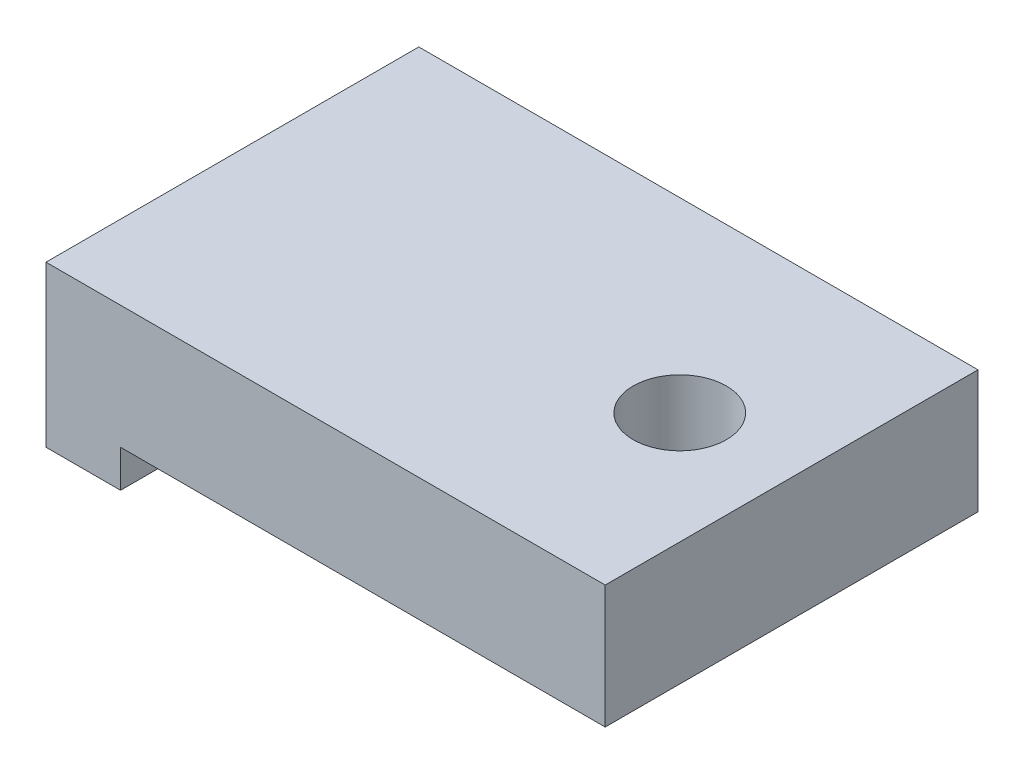
ISO-10303-21;
HEADER;
FILE_DESCRIPTION(('STEP AP214'),'2;1');
FILE_NAME('part.step','',(''),(''),'','','');
FILE_SCHEMA(('AUTOMOTIVE_DESIGN { 1 0 10303 214 1 1 1 1 }'));
ENDSEC;
DATA;
#1=APPLICATION_CONTEXT('core data for automotive mechanical design processes');
#2=APPLICATION_PROTOCOL_DEFINITION('international standard','automotive_design',2000,#1);
#3=PRODUCT_CONTEXT('',#1,'mechanical');
#4=PRODUCT('Part','Part','',(#3));
#5=PRODUCT_RELATED_PRODUCT_CATEGORY('part','',(#4));
#6=PRODUCT_DEFINITION_FORMATION('','',#4);
#7=PRODUCT_DEFINITION_CONTEXT('part definition',#1,'design');
#8=PRODUCT_DEFINITION('design','',#6,#7);
#9=PRODUCT_DEFINITION_SHAPE('','',#8);
#10=(LENGTH_UNIT() NAMED_UNIT(*) SI_UNIT(.MILLI.,.METRE.));
#11=(NAMED_UNIT(*) PLANE_ANGLE_UNIT() SI_UNIT($,.RADIAN.));
#12=(NAMED_UNIT(*) SI_UNIT($,.STERADIAN.) SOLID_ANGLE_UNIT());
#13=UNCERTAINTY_MEASURE_WITH_UNIT(LENGTH_MEASURE(1.E-05),#10,'distance_accuracy_value','');
#14=(GEOMETRIC_REPRESENTATION_CONTEXT(3) GLOBAL_UNCERTAINTY_ASSIGNED_CONTEXT((#13)) GLOBAL_UNIT_ASSIGNED_CONTEXT((#10,
#11,#12)) REPRESENTATION_CONTEXT('',''));
#15=CARTESIAN_POINT('',(0.,0.,0.));
#16=DIRECTION('',(0.,0.,1.));
#17=DIRECTION('',(1.,0.,0.));
#18=AXIS2_PLACEMENT_3D('',#15,#16,#17);
#19=CARTESIAN_POINT('',(-5.50000000000001,-1.,-5.));
#20=DIRECTION('',(-1.,0.,0.));
#21=DIRECTION('',(0.,0.,1.));
#22=AXIS2_PLACEMENT_3D('',#19,#20,#21);
#23=PLANE('',#22);
#24=DIRECTION('',(0.,1.,0.));
#25=VECTOR('',#24,1.);
#26=CARTESIAN_POINT('',(-5.50000000000001,-1.,5.00000000000001));
#27=LINE('',#26,#25);
#28=CARTESIAN_POINT('',(-5.50000000000001,-1.,5.00000000000001));
#29=VERTEX_POINT('',#28);
#30=CARTESIAN_POINT('',(-5.50000000000001,0.,5.00000000000001));
#31=VERTEX_POINT('',#30);
#32=EDGE_CURVE('E68',#29,#31,#27,.T.);
#33=ORIENTED_EDGE('',*,*,#32,.F.);
#34=DIRECTION('',(0.,0.,1.));
#35=VECTOR('',#34,1.);
#36=CARTESIAN_POINT('',(-5.50000000000001,-1.,0.));
#37=LINE('',#36,#35);
#38=CARTESIAN_POINT('',(-5.50000000000001,-1.,-5.));
#39=VERTEX_POINT('',#38);
#40=EDGE_CURVE('E79',#29,#39,#37,.F.);
#41=ORIENTED_EDGE('',*,*,#40,.T.);
#42=DIRECTION('',(0.,1.,0.));
#43=VECTOR('',#42,1.);
#44=CARTESIAN_POINT('',(-5.50000000000001,-1.,-5.));
#45=LINE('',#44,#43);
#46=CARTESIAN_POINT('',(-5.50000000000001,0.,-5.));
#47=VERTEX_POINT('',#46);
#48=EDGE_CURVE('E80',#47,#39,#45,.F.);
#49=ORIENTED_EDGE('',*,*,#48,.F.);
#50=DIRECTION('',(0.,0.,-1.));
#51=VECTOR('',#50,1.);
#52=CARTESIAN_POINT('',(-5.50000000000001,0.,0.));
#53=LINE('',#52,#51);
#54=EDGE_CURVE('E83',#31,#47,#53,.T.);
#55=ORIENTED_EDGE('',*,*,#54,.F.);
#56=EDGE_LOOP('',(#33,#41,#49,#55));
#57=FACE_BOUND('',#56,.T.);
#58=ADVANCED_FACE('F17',(#57),#23,.F.);
#59=CARTESIAN_POINT('',(4.49999999999999,0.,0.));
#60=DIRECTION('',(0.,-1.,0.));
#61=DIRECTION('',(0.,0.,-1.));
#62=AXIS2_PLACEMENT_3D('',#59,#60,#61);
#63=CONICAL_SURFACE('',#62,1.74999999995862,0.785398163340605);
#64=CARTESIAN_POINT('',(4.49999999999999,0.499999999999994,0.));
#65=DIRECTION('',(0.,-1.,0.));
#66=DIRECTION('',(0.,0.,-1.));
#67=AXIS2_PLACEMENT_3D('',#64,#65,#66);
#68=CIRCLE('',#67,1.24999999999999);
#69=CARTESIAN_POINT('',(4.49999999999999,0.499999999999994,-1.24999999999999));
#70=VERTEX_POINT('',#69);
#71=EDGE_CURVE('E86',#70,#70,#68,.F.);
#72=ORIENTED_EDGE('',*,*,#71,.T.);
#73=EDGE_LOOP('',(#72));
#74=FACE_BOUND('',#73,.T.);
#75=CARTESIAN_POINT('',(4.49999999999999,0.,0.));
#76=DIRECTION('',(0.,-1.,0.));
#77=DIRECTION('',(0.,0.,-1.));
#78=AXIS2_PLACEMENT_3D('',#75,#76,#77);
#79=CIRCLE('',#78,1.74999999995862);
#80=CARTESIAN_POINT('',(4.49999999999999,0.,-1.74999999995862));
#81=VERTEX_POINT('',#80);
#82=EDGE_CURVE('E20',#81,#81,#79,.F.);
#83=ORIENTED_EDGE('',*,*,#82,.F.);
#84=EDGE_LOOP('',(#83));
#85=FACE_BOUND('',#84,.T.);
#86=ADVANCED_FACE('F140',(#74,#85),#63,.F.);
#87=CARTESIAN_POINT('',(0.,-1.,0.));
#88=DIRECTION('',(0.,1.,0.));
#89=DIRECTION('',(0.,0.,1.));
#90=AXIS2_PLACEMENT_3D('',#87,#88,#89);
#91=PLANE('',#90);
#92=DIRECTION('',(1.,0.,0.));
#93=VECTOR('',#92,1.);
#94=CARTESIAN_POINT('',(-7.50000000000001,-1.,-5.));
#95=LINE('',#94,#93);
#96=CARTESIAN_POINT('',(-7.50000000000001,-1.,-5.));
#97=VERTEX_POINT('',#96);
#98=EDGE_CURVE('E116',#97,#39,#95,.T.);
#99=ORIENTED_EDGE('',*,*,#98,.T.);
#100=ORIENTED_EDGE('',*,*,#40,.F.);
#101=DIRECTION('',(-1.,0.,0.));
#102=VECTOR('',#101,1.);
#103=CARTESIAN_POINT('',(-7.50000000000001,-1.,5.00000000000001));
#104=LINE('',#103,#102);
#105=CARTESIAN_POINT('',(-7.50000000000001,-1.,5.00000000000001));
#106=VERTEX_POINT('',#105);
#107=EDGE_CURVE('E78',#29,#106,#104,.T.);
#108=ORIENTED_EDGE('',*,*,#107,.T.);
#109=DIRECTION('',(0.,0.,-1.));
#110=VECTOR('',#109,1.);
#111=CARTESIAN_POINT('',(-7.50000000000001,-1.,5.00000000000001));
#112=LINE('',#111,#110);
#113=EDGE_CURVE('E122',#106,#97,#112,.T.);
#114=ORIENTED_EDGE('',*,*,#113,.T.);
#115=EDGE_LOOP('',(#99,#100,#108,#114));
#116=FACE_BOUND('',#115,.T.);
#117=ADVANCED_FACE('F138',(#116),#91,.F.);
#118=CARTESIAN_POINT('',(0.,0.,0.));
#119=DIRECTION('',(0.,-1.,0.));
#120=DIRECTION('',(0.,0.,-1.));
#121=AXIS2_PLACEMENT_3D('',#118,#119,#120);
#122=PLANE('',#121);
#123=DIRECTION('',(0.,0.,1.));
#124=VECTOR('',#123,1.);
#125=CARTESIAN_POINT('',(7.49999999999999,0.,5.00000000000001));
#126=LINE('',#125,#124);
#127=CARTESIAN_POINT('',(7.49999999999999,0.,-5.));
#128=VERTEX_POINT('',#127);
#129=CARTESIAN_POINT('',(7.49999999999999,0.,5.00000000000001));
#130=VERTEX_POINT('',#129);
#131=EDGE_CURVE('E91',#128,#130,#126,.T.);
#132=ORIENTED_EDGE('',*,*,#131,.T.);
#133=DIRECTION('',(-1.,0.,0.));
#134=VECTOR('',#133,1.);
#135=CARTESIAN_POINT('',(-7.50000000000001,0.,5.00000000000001));
#136=LINE('',#135,#134);
#137=EDGE_CURVE('E75',#130,#31,#136,.T.);
#138=ORIENTED_EDGE('',*,*,#137,.T.);
#139=ORIENTED_EDGE('',*,*,#54,.T.);
#140=DIRECTION('',(1.,0.,0.));
#141=VECTOR('',#140,1.);
#142=CARTESIAN_POINT('',(-7.50000000000001,0.,-5.));
#143=LINE('',#142,#141);
#144=EDGE_CURVE('E114',#47,#128,#143,.T.);
#145=ORIENTED_EDGE('',*,*,#144,.T.);
#146=EDGE_LOOP('',(#132,#138,#139,#145));
#147=FACE_BOUND('',#146,.T.);
#148=ORIENTED_EDGE('',*,*,#82,.T.);
#149=EDGE_LOOP('',(#148));
#150=FACE_BOUND('',#149,.T.);
#151=ADVANCED_FACE('F89',(#147,#150),#122,.T.);
#152=CARTESIAN_POINT('',(4.49999999999999,0.,0.));
#153=DIRECTION('',(0.,-1.,0.));
#154=DIRECTION('',(0.,0.,-1.));
#155=AXIS2_PLACEMENT_3D('',#152,#153,#154);
#156=CYLINDRICAL_SURFACE('',#155,1.24999999999999);
#157=CARTESIAN_POINT('',(4.49999999999999,3.3,0.));
#158=DIRECTION('',(0.,-1.,0.));
#159=DIRECTION('',(0.,0.,-1.));
#160=AXIS2_PLACEMENT_3D('',#157,#158,#159);
#161=CIRCLE('',#160,1.24999999999999);
#162=CARTESIAN_POINT('',(4.49999999999999,3.3,-1.24999999999999));
#163=VERTEX_POINT('',#162);
#164=EDGE_CURVE('E100',#163,#163,#161,.F.);
#165=ORIENTED_EDGE('',*,*,#164,.T.);
#166=EDGE_LOOP('',(#165));
#167=FACE_BOUND('',#166,.T.);
#168=ORIENTED_EDGE('',*,*,#71,.F.);
#169=EDGE_LOOP('',(#168));
#170=FACE_BOUND('',#169,.T.);
#171=ADVANCED_FACE('F147',(#167,#170),#156,.F.);
#172=CARTESIAN_POINT('',(-7.50000000000001,3.3,5.00000000000001));
#173=DIRECTION('',(0.,0.,-1.));
#174=DIRECTION('',(-1.,0.,0.));
#175=AXIS2_PLACEMENT_3D('',#172,#173,#174);
#176=PLANE('',#175);
#177=ORIENTED_EDGE('',*,*,#107,.F.);
#178=ORIENTED_EDGE('',*,*,#32,.T.);
#179=ORIENTED_EDGE('',*,*,#137,.F.);
#180=DIRECTION('',(0.,1.,0.));
#181=VECTOR('',#180,1.);
#182=CARTESIAN_POINT('',(7.49999999999999,3.3,5.00000000000001));
#183=LINE('',#182,#181);
#184=CARTESIAN_POINT('',(7.49999999999999,3.3,5.00000000000001));
#185=VERTEX_POINT('',#184);
#186=EDGE_CURVE('E109',#130,#185,#183,.T.);
#187=ORIENTED_EDGE('',*,*,#186,.T.);
#188=DIRECTION('',(1.,0.,0.));
#189=VECTOR('',#188,1.);
#190=CARTESIAN_POINT('',(0.,3.3,5.00000000000001));
#191=LINE('',#190,#189);
#192=CARTESIAN_POINT('',(-7.50000000000001,3.3,5.00000000000001));
#193=VERTEX_POINT('',#192);
#194=EDGE_CURVE('E102',#185,#193,#191,.F.);
#195=ORIENTED_EDGE('',*,*,#194,.T.);
#196=DIRECTION('',(0.,1.,0.));
#197=VECTOR('',#196,1.);
#198=CARTESIAN_POINT('',(-7.50000000000001,3.3,5.00000000000001));
#199=LINE('',#198,#197);
#200=EDGE_CURVE('E93',#193,#106,#199,.F.);
#201=ORIENTED_EDGE('',*,*,#200,.T.);
#202=EDGE_LOOP('',(#177,#178,#179,#187,#195,#201));
#203=FACE_BOUND('',#202,.T.);
#204=ADVANCED_FACE('F72',(#203),#176,.F.);
#205=CARTESIAN_POINT('',(-7.50000000000001,3.3,5.00000000000001));
#206=DIRECTION('',(1.,0.,0.));
#207=DIRECTION('',(0.,0.,-1.));
#208=AXIS2_PLACEMENT_3D('',#205,#206,#207);
#209=PLANE('',#208);
#210=ORIENTED_EDGE('',*,*,#113,.F.);
#211=ORIENTED_EDGE('',*,*,#200,.F.);
#212=DIRECTION('',(0.,0.,-1.));
#213=VECTOR('',#212,1.);
#214=CARTESIAN_POINT('',(-7.50000000000001,3.3,0.));
#215=LINE('',#214,#213);
#216=CARTESIAN_POINT('',(-7.50000000000001,3.3,-5.));
#217=VERTEX_POINT('',#216);
#218=EDGE_CURVE('E106',#193,#217,#215,.T.);
#219=ORIENTED_EDGE('',*,*,#218,.T.);
#220=DIRECTION('',(0.,1.,0.));
#221=VECTOR('',#220,1.);
#222=CARTESIAN_POINT('',(-7.50000000000001,3.3,-5.));
#223=LINE('',#222,#221);
#224=EDGE_CURVE('E119',#217,#97,#223,.F.);
#225=ORIENTED_EDGE('',*,*,#224,.T.);
#226=EDGE_LOOP('',(#210,#211,#219,#225));
#227=FACE_BOUND('',#226,.T.);
#228=ADVANCED_FACE('F127',(#227),#209,.F.);
#229=CARTESIAN_POINT('',(-7.50000000000001,3.3,-5.));
#230=DIRECTION('',(0.,0.,1.));
#231=DIRECTION('',(1.,0.,0.));
#232=AXIS2_PLACEMENT_3D('',#229,#230,#231);
#233=PLANE('',#232);
#234=ORIENTED_EDGE('',*,*,#48,.T.);
#235=ORIENTED_EDGE('',*,*,#98,.F.);
#236=ORIENTED_EDGE('',*,*,#224,.F.);
#237=DIRECTION('',(1.,0.,0.));
#238=VECTOR('',#237,1.);
#239=CARTESIAN_POINT('',(0.,3.3,-5.));
#240=LINE('',#239,#238);
#241=CARTESIAN_POINT('',(7.49999999999999,3.3,-5.));
#242=VERTEX_POINT('',#241);
#243=EDGE_CURVE('E26',#217,#242,#240,.T.);
#244=ORIENTED_EDGE('',*,*,#243,.T.);
#245=DIRECTION('',(0.,1.,0.));
#246=VECTOR('',#245,1.);
#247=CARTESIAN_POINT('',(7.49999999999999,3.3,-5.));
#248=LINE('',#247,#246);
#249=EDGE_CURVE('E34',#242,#128,#248,.F.);
#250=ORIENTED_EDGE('',*,*,#249,.T.);
#251=ORIENTED_EDGE('',*,*,#144,.F.);
#252=EDGE_LOOP('',(#234,#235,#236,#244,#250,#251));
#253=FACE_BOUND('',#252,.T.);
#254=ADVANCED_FACE('F135',(#253),#233,.F.);
#255=CARTESIAN_POINT('',(7.49999999999999,3.3,5.00000000000001));
#256=DIRECTION('',(-1.,0.,0.));
#257=DIRECTION('',(0.,0.,1.));
#258=AXIS2_PLACEMENT_3D('',#255,#256,#257);
#259=PLANE('',#258);
#260=ORIENTED_EDGE('',*,*,#249,.F.);
#261=DIRECTION('',(0.,0.,-1.));
#262=VECTOR('',#261,1.);
#263=CARTESIAN_POINT('',(7.49999999999999,3.3,0.));
#264=LINE('',#263,#262);
#265=EDGE_CURVE('E11',#242,#185,#264,.F.);
#266=ORIENTED_EDGE('',*,*,#265,.T.);
#267=ORIENTED_EDGE('',*,*,#186,.F.);
#268=ORIENTED_EDGE('',*,*,#131,.F.);
#269=EDGE_LOOP('',(#260,#266,#267,#268));
#270=FACE_BOUND('',#269,.T.);
#271=ADVANCED_FACE('F151',(#270),#259,.F.);
#272=CARTESIAN_POINT('',(0.,3.3,0.));
#273=DIRECTION('',(0.,-1.,0.));
#274=DIRECTION('',(0.,0.,-1.));
#275=AXIS2_PLACEMENT_3D('',#272,#273,#274);
#276=PLANE('',#275);
#277=ORIENTED_EDGE('',*,*,#243,.F.);
#278=ORIENTED_EDGE('',*,*,#218,.F.);
#279=ORIENTED_EDGE('',*,*,#194,.F.);
#280=ORIENTED_EDGE('',*,*,#265,.F.);
#281=EDGE_LOOP('',(#277,#278,#279,#280));
#282=FACE_BOUND('',#281,.T.);
#283=ORIENTED_EDGE('',*,*,#164,.F.);
#284=EDGE_LOOP('',(#283));
#285=FACE_BOUND('',#284,.T.);
#286=ADVANCED_FACE('F130',(#282,#285),#276,.F.);
#287=CLOSED_SHELL('',(#58,#86,#117,#151,#171,#204,#228,#254,#271,#286));
#288=MANIFOLD_SOLID_BREP('B1',#287);
#289=ADVANCED_BREP_SHAPE_REPRESENTATION('',(#18,#288),#14);
#290=SHAPE_DEFINITION_REPRESENTATION(#9,#289);
ENDSEC;
END-ISO-10303-21;
